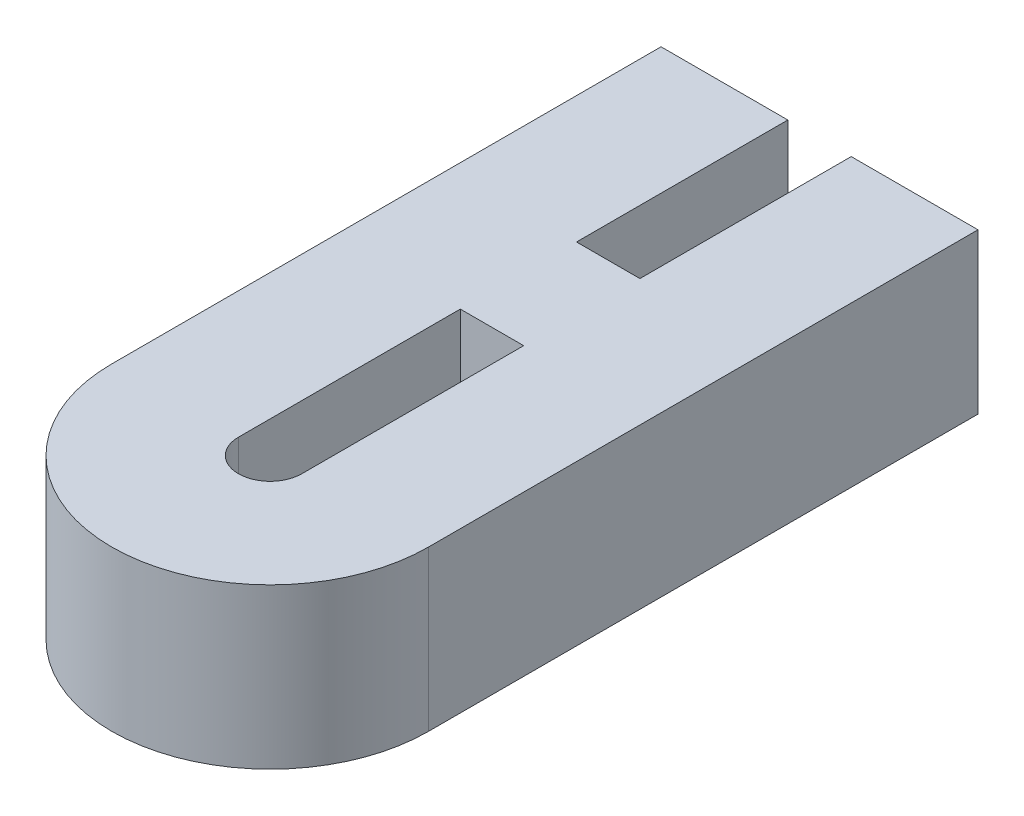
ISO-10303-21;
HEADER;
FILE_DESCRIPTION(('STEP AP214'),'2;1');
FILE_NAME('part.step','',(''),(''),'','','');
FILE_SCHEMA(('AUTOMOTIVE_DESIGN { 1 0 10303 214 1 1 1 1 }'));
ENDSEC;
DATA;
#1=APPLICATION_CONTEXT('core data for automotive mechanical design processes');
#2=APPLICATION_PROTOCOL_DEFINITION('international standard','automotive_design',2000,#1);
#3=PRODUCT_CONTEXT('',#1,'mechanical');
#4=PRODUCT('Part','Part','',(#3));
#5=PRODUCT_RELATED_PRODUCT_CATEGORY('part','',(#4));
#6=PRODUCT_DEFINITION_FORMATION('','',#4);
#7=PRODUCT_DEFINITION_CONTEXT('part definition',#1,'design');
#8=PRODUCT_DEFINITION('design','',#6,#7);
#9=PRODUCT_DEFINITION_SHAPE('','',#8);
#10=(LENGTH_UNIT() NAMED_UNIT(*) SI_UNIT(.MILLI.,.METRE.));
#11=(NAMED_UNIT(*) PLANE_ANGLE_UNIT() SI_UNIT($,.RADIAN.));
#12=(NAMED_UNIT(*) SI_UNIT($,.STERADIAN.) SOLID_ANGLE_UNIT());
#13=UNCERTAINTY_MEASURE_WITH_UNIT(LENGTH_MEASURE(1.E-05),#10,'distance_accuracy_value','');
#14=(GEOMETRIC_REPRESENTATION_CONTEXT(3) GLOBAL_UNCERTAINTY_ASSIGNED_CONTEXT((#13)) GLOBAL_UNIT_ASSIGNED_CONTEXT((#10,
#11,#12)) REPRESENTATION_CONTEXT('',''));
#15=CARTESIAN_POINT('',(0.,0.,0.));
#16=DIRECTION('',(0.,0.,1.));
#17=DIRECTION('',(1.,0.,0.));
#18=AXIS2_PLACEMENT_3D('',#15,#16,#17);
#19=CARTESIAN_POINT('',(1791.35975597724,-278.499891429945,2589.62563346975));
#20=DIRECTION('',(0.,-1.,0.));
#21=DIRECTION('',(0.,0.,-1.));
#22=AXIS2_PLACEMENT_3D('',#19,#20,#21);
#23=PLANE('',#22);
#24=DIRECTION('',(1.,0.,0.));
#25=VECTOR('',#24,1.);
#26=CARTESIAN_POINT('',(1796.07481015761,-278.499891429945,2507.8980276768));
#27=LINE('',#26,#25);
#28=CARTESIAN_POINT('',(1796.07481015761,-278.499891429945,2507.8980276768));
#29=VERTEX_POINT('',#28);
#30=CARTESIAN_POINT('',(1814.93502687905,-278.499891429945,2507.8980276768));
#31=VERTEX_POINT('',#30);
#32=EDGE_CURVE('E121',#29,#31,#27,.T.);
#33=ORIENTED_EDGE('',*,*,#32,.F.);
#34=DIRECTION('',(0.,0.,-1.));
#35=VECTOR('',#34,1.);
#36=CARTESIAN_POINT('',(1796.07481015761,-278.499891429945,2539.33172221255));
#37=LINE('',#36,#35);
#38=CARTESIAN_POINT('',(1796.07481015761,-278.499891429945,2539.33172221255));
#39=VERTEX_POINT('',#38);
#40=EDGE_CURVE('E150',#39,#29,#37,.T.);
#41=ORIENTED_EDGE('',*,*,#40,.F.);
#42=DIRECTION('',(1.,0.,0.));
#43=VECTOR('',#42,1.);
#44=CARTESIAN_POINT('',(1786.64470179688,-278.499891429945,2539.33172221255));
#45=LINE('',#44,#43);
#46=CARTESIAN_POINT('',(1786.64470179688,-278.499891429945,2539.33172221255));
#47=VERTEX_POINT('',#46);
#48=EDGE_CURVE('E147',#47,#39,#45,.T.);
#49=ORIENTED_EDGE('',*,*,#48,.F.);
#50=DIRECTION('',(0.,0.,1.));
#51=VECTOR('',#50,1.);
#52=CARTESIAN_POINT('',(1786.64470179688,-278.499891429945,2507.8980276768));
#53=LINE('',#52,#51);
#54=CARTESIAN_POINT('',(1786.64470179688,-278.499891429945,2507.8980276768));
#55=VERTEX_POINT('',#54);
#56=EDGE_CURVE('E144',#55,#47,#53,.T.);
#57=ORIENTED_EDGE('',*,*,#56,.F.);
#58=DIRECTION('',(1.,0.,0.));
#59=VECTOR('',#58,1.);
#60=CARTESIAN_POINT('',(1767.78448507543,-278.499891429945,2507.8980276768));
#61=LINE('',#60,#59);
#62=CARTESIAN_POINT('',(1767.78448507543,-278.499891429945,2507.8980276768));
#63=VERTEX_POINT('',#62);
#64=EDGE_CURVE('E141',#63,#55,#61,.T.);
#65=ORIENTED_EDGE('',*,*,#64,.F.);
#66=DIRECTION('',(0.,0.,-1.));
#67=VECTOR('',#66,1.);
#68=CARTESIAN_POINT('',(1767.78448507543,-278.499891429945,2589.62563346975));
#69=LINE('',#68,#67);
#70=CARTESIAN_POINT('',(1767.78448507543,-278.499891429945,2589.62563346975));
#71=VERTEX_POINT('',#70);
#72=EDGE_CURVE('E138',#71,#63,#69,.T.);
#73=ORIENTED_EDGE('',*,*,#72,.F.);
#74=CARTESIAN_POINT('',(1791.35975597724,-278.499891429945,2589.62563346975));
#75=DIRECTION('',(0.,-1.,0.));
#76=DIRECTION('',(0.,0.,-1.));
#77=AXIS2_PLACEMENT_3D('',#74,#75,#76);
#78=CIRCLE('',#77,23.5752709018111);
#79=CARTESIAN_POINT('',(1814.93502687905,-278.499891429945,2589.62563346975));
#80=VERTEX_POINT('',#79);
#81=EDGE_CURVE('E135',#80,#71,#78,.T.);
#82=ORIENTED_EDGE('',*,*,#81,.F.);
#83=DIRECTION('',(0.,0.,1.));
#84=VECTOR('',#83,1.);
#85=CARTESIAN_POINT('',(1814.93502687905,-278.499891429945,2507.8980276768));
#86=LINE('',#85,#84);
#87=EDGE_CURVE('E132',#31,#80,#86,.T.);
#88=ORIENTED_EDGE('',*,*,#87,.F.);
#89=EDGE_LOOP('',(#33,#41,#49,#57,#65,#73,#82,#88));
#90=FACE_BOUND('',#89,.T.);
#91=DIRECTION('',(0.,0.,1.));
#92=VECTOR('',#91,1.);
#93=CARTESIAN_POINT('',(1786.64470179688,-278.499891429945,2556.62025420721));
#94=LINE('',#93,#92);
#95=CARTESIAN_POINT('',(1786.64470179688,-278.499891429945,2556.62025420721));
#96=VERTEX_POINT('',#95);
#97=CARTESIAN_POINT('',(1786.64470179688,-278.499891429945,2589.62563346975));
#98=VERTEX_POINT('',#97);
#99=EDGE_CURVE('E109',#96,#98,#94,.T.);
#100=ORIENTED_EDGE('',*,*,#99,.F.);
#101=DIRECTION('',(-1.,0.,0.));
#102=VECTOR('',#101,1.);
#103=CARTESIAN_POINT('',(1796.07481015761,-278.499891429945,2556.62025420721));
#104=LINE('',#103,#102);
#105=CARTESIAN_POINT('',(1796.07481015761,-278.499891429945,2556.62025420721));
#106=VERTEX_POINT('',#105);
#107=EDGE_CURVE('E117',#106,#96,#104,.T.);
#108=ORIENTED_EDGE('',*,*,#107,.F.);
#109=DIRECTION('',(0.,0.,-1.));
#110=VECTOR('',#109,1.);
#111=CARTESIAN_POINT('',(1796.07481015761,-278.499891429945,2589.62563346975));
#112=LINE('',#111,#110);
#113=CARTESIAN_POINT('',(1796.07481015761,-278.499891429953,2589.62563346975));
#114=VERTEX_POINT('',#113);
#115=EDGE_CURVE('E122',#114,#106,#112,.T.);
#116=ORIENTED_EDGE('',*,*,#115,.F.);
#117=CARTESIAN_POINT('',(1791.35975597724,-278.499891429953,2589.62563346975));
#118=DIRECTION('',(0.,1.,0.));
#119=DIRECTION('',(0.,0.,-1.));
#120=AXIS2_PLACEMENT_3D('',#117,#118,#119);
#121=CIRCLE('',#120,4.71505418036223);
#122=EDGE_CURVE('E125',#98,#114,#121,.T.);
#123=ORIENTED_EDGE('',*,*,#122,.F.);
#124=EDGE_LOOP('',(#100,#108,#116,#123));
#125=FACE_BOUND('',#124,.T.);
#126=ADVANCED_FACE('F16',(#90,#125),#23,.F.);
#127=CARTESIAN_POINT('',(1796.07481015761,-282.250162855083,2589.62563346975));
#128=DIRECTION('',(-1.,0.,0.));
#129=DIRECTION('',(0.,0.,1.));
#130=AXIS2_PLACEMENT_3D('',#127,#128,#129);
#131=PLANE('',#130);
#132=DIRECTION('',(0.,-1.,0.));
#133=VECTOR('',#132,1.);
#134=CARTESIAN_POINT('',(1796.07481015761,-282.250162855083,2589.62563346975));
#135=LINE('',#134,#133);
#136=CARTESIAN_POINT('',(1796.07481015761,-302.250162855083,2589.62563346975));
#137=VERTEX_POINT('',#136);
#138=EDGE_CURVE('E159',#114,#137,#135,.T.);
#139=ORIENTED_EDGE('',*,*,#138,.F.);
#140=ORIENTED_EDGE('',*,*,#115,.T.);
#141=DIRECTION('',(0.,-1.,0.));
#142=VECTOR('',#141,1.);
#143=CARTESIAN_POINT('',(1796.07481015761,-282.250162855083,2556.62025420721));
#144=LINE('',#143,#142);
#145=CARTESIAN_POINT('',(1796.07481015761,-302.250162855083,2556.62025420721));
#146=VERTEX_POINT('',#145);
#147=EDGE_CURVE('E20',#106,#146,#144,.T.);
#148=ORIENTED_EDGE('',*,*,#147,.T.);
#149=DIRECTION('',(0.,0.,-1.));
#150=VECTOR('',#149,1.);
#151=CARTESIAN_POINT('',(1796.07481015761,-302.250162855083,2589.62563346975));
#152=LINE('',#151,#150);
#153=EDGE_CURVE('E153',#137,#146,#152,.T.);
#154=ORIENTED_EDGE('',*,*,#153,.F.);
#155=EDGE_LOOP('',(#139,#140,#148,#154));
#156=FACE_BOUND('',#155,.T.);
#157=ADVANCED_FACE('F201',(#156),#131,.T.);
#158=CARTESIAN_POINT('',(1791.35975597724,-282.250162855083,2589.62563346975));
#159=DIRECTION('',(0.,-1.,0.));
#160=DIRECTION('',(0.,0.,-1.));
#161=AXIS2_PLACEMENT_3D('',#158,#159,#160);
#162=CYLINDRICAL_SURFACE('',#161,4.71505418036223);
#163=DIRECTION('',(0.,-1.,0.));
#164=VECTOR('',#163,1.);
#165=CARTESIAN_POINT('',(1786.64470179688,-282.250162855083,2589.62563346975));
#166=LINE('',#165,#164);
#167=CARTESIAN_POINT('',(1786.64470179688,-302.250162855083,2589.62563346975));
#168=VERTEX_POINT('',#167);
#169=EDGE_CURVE('E155',#98,#168,#166,.T.);
#170=ORIENTED_EDGE('',*,*,#169,.F.);
#171=ORIENTED_EDGE('',*,*,#122,.T.);
#172=ORIENTED_EDGE('',*,*,#138,.T.);
#173=CARTESIAN_POINT('',(1791.35975597724,-302.250162855083,2589.62563346975));
#174=DIRECTION('',(0.,-1.,0.));
#175=DIRECTION('',(-1.,0.,0.));
#176=AXIS2_PLACEMENT_3D('',#173,#174,#175);
#177=CIRCLE('',#176,4.71505418036223);
#178=EDGE_CURVE('E156',#137,#168,#177,.T.);
#179=ORIENTED_EDGE('',*,*,#178,.T.);
#180=EDGE_LOOP('',(#170,#171,#172,#179));
#181=FACE_BOUND('',#180,.T.);
#182=ADVANCED_FACE('F205',(#181),#162,.F.);
#183=CARTESIAN_POINT('',(1786.64470179688,-282.250162855083,2589.62563346975));
#184=DIRECTION('',(-1.,0.,0.));
#185=DIRECTION('',(0.,0.,1.));
#186=AXIS2_PLACEMENT_3D('',#183,#184,#185);
#187=PLANE('',#186);
#188=DIRECTION('',(0.,-1.,0.));
#189=VECTOR('',#188,1.);
#190=CARTESIAN_POINT('',(1786.64470179688,-282.250162855083,2556.62025420721));
#191=LINE('',#190,#189);
#192=CARTESIAN_POINT('',(1786.64470179688,-302.250162855083,2556.62025420721));
#193=VERTEX_POINT('',#192);
#194=EDGE_CURVE('E106',#96,#193,#191,.T.);
#195=ORIENTED_EDGE('',*,*,#194,.F.);
#196=ORIENTED_EDGE('',*,*,#99,.T.);
#197=ORIENTED_EDGE('',*,*,#169,.T.);
#198=DIRECTION('',(0.,0.,-1.));
#199=VECTOR('',#198,1.);
#200=CARTESIAN_POINT('',(1786.64470179688,-302.250162855083,2589.62563346975));
#201=LINE('',#200,#199);
#202=EDGE_CURVE('E112',#168,#193,#201,.T.);
#203=ORIENTED_EDGE('',*,*,#202,.T.);
#204=EDGE_LOOP('',(#195,#196,#197,#203));
#205=FACE_BOUND('',#204,.T.);
#206=ADVANCED_FACE('F107',(#205),#187,.F.);
#207=CARTESIAN_POINT('',(1786.64470179688,-282.250162855083,2556.62025420721));
#208=DIRECTION('',(0.,0.,-1.));
#209=DIRECTION('',(-1.,0.,0.));
#210=AXIS2_PLACEMENT_3D('',#207,#208,#209);
#211=PLANE('',#210);
#212=ORIENTED_EDGE('',*,*,#147,.F.);
#213=ORIENTED_EDGE('',*,*,#107,.T.);
#214=ORIENTED_EDGE('',*,*,#194,.T.);
#215=DIRECTION('',(1.,0.,0.));
#216=VECTOR('',#215,1.);
#217=CARTESIAN_POINT('',(1786.64470179688,-302.250162855083,2556.62025420721));
#218=LINE('',#217,#216);
#219=EDGE_CURVE('E114',#193,#146,#218,.T.);
#220=ORIENTED_EDGE('',*,*,#219,.T.);
#221=EDGE_LOOP('',(#212,#213,#214,#220));
#222=FACE_BOUND('',#221,.T.);
#223=ADVANCED_FACE('F118',(#222),#211,.F.);
#224=CARTESIAN_POINT('',(1791.35975597724,-302.250162855083,2589.62563346975));
#225=DIRECTION('',(0.,-1.,0.));
#226=DIRECTION('',(0.,0.,-1.));
#227=AXIS2_PLACEMENT_3D('',#224,#225,#226);
#228=PLANE('',#227);
#229=ORIENTED_EDGE('',*,*,#219,.F.);
#230=ORIENTED_EDGE('',*,*,#202,.F.);
#231=ORIENTED_EDGE('',*,*,#178,.F.);
#232=ORIENTED_EDGE('',*,*,#153,.T.);
#233=EDGE_LOOP('',(#229,#230,#231,#232));
#234=FACE_BOUND('',#233,.T.);
#235=DIRECTION('',(0.,0.,-1.));
#236=VECTOR('',#235,1.);
#237=CARTESIAN_POINT('',(1796.07481015761,-302.250162855083,2539.33172221255));
#238=LINE('',#237,#236);
#239=CARTESIAN_POINT('',(1796.07481015761,-302.250162855083,2539.33172221255));
#240=VERTEX_POINT('',#239);
#241=CARTESIAN_POINT('',(1796.07481015761,-302.250162855083,2507.8980276768));
#242=VERTEX_POINT('',#241);
#243=EDGE_CURVE('E162',#240,#242,#238,.T.);
#244=ORIENTED_EDGE('',*,*,#243,.T.);
#245=DIRECTION('',(-1.,0.,0.));
#246=VECTOR('',#245,1.);
#247=CARTESIAN_POINT('',(1814.93502687905,-302.250162855083,2507.8980276768));
#248=LINE('',#247,#246);
#249=CARTESIAN_POINT('',(1814.93502687905,-302.250162855083,2507.8980276768));
#250=VERTEX_POINT('',#249);
#251=EDGE_CURVE('E25',#250,#242,#248,.T.);
#252=ORIENTED_EDGE('',*,*,#251,.F.);
#253=DIRECTION('',(0.,0.,-1.));
#254=VECTOR('',#253,1.);
#255=CARTESIAN_POINT('',(1814.93502687905,-302.250162855083,2589.62563346975));
#256=LINE('',#255,#254);
#257=CARTESIAN_POINT('',(1814.93502687905,-302.250162855083,2589.62563346975));
#258=VERTEX_POINT('',#257);
#259=EDGE_CURVE('E184',#258,#250,#256,.T.);
#260=ORIENTED_EDGE('',*,*,#259,.F.);
#261=CARTESIAN_POINT('',(1791.35975597724,-302.250162855083,2589.62563346975));
#262=DIRECTION('',(0.,-1.,0.));
#263=DIRECTION('',(-1.,0.,0.));
#264=AXIS2_PLACEMENT_3D('',#261,#262,#263);
#265=CIRCLE('',#264,23.5752709018111);
#266=CARTESIAN_POINT('',(1767.78448507543,-302.250162855083,2589.62563346975));
#267=VERTEX_POINT('',#266);
#268=EDGE_CURVE('E165',#258,#267,#265,.T.);
#269=ORIENTED_EDGE('',*,*,#268,.T.);
#270=DIRECTION('',(0.,0.,-1.));
#271=VECTOR('',#270,1.);
#272=CARTESIAN_POINT('',(1767.78448507543,-302.250162855083,2589.62563346975));
#273=LINE('',#272,#271);
#274=CARTESIAN_POINT('',(1767.78448507543,-302.250162855083,2507.8980276768));
#275=VERTEX_POINT('',#274);
#276=EDGE_CURVE('E170',#267,#275,#273,.T.);
#277=ORIENTED_EDGE('',*,*,#276,.T.);
#278=DIRECTION('',(-1.,0.,0.));
#279=VECTOR('',#278,1.);
#280=CARTESIAN_POINT('',(1786.64470179688,-302.250162855083,2507.8980276768));
#281=LINE('',#280,#279);
#282=CARTESIAN_POINT('',(1786.64470179688,-302.250162855083,2507.8980276768));
#283=VERTEX_POINT('',#282);
#284=EDGE_CURVE('E176',#283,#275,#281,.T.);
#285=ORIENTED_EDGE('',*,*,#284,.F.);
#286=DIRECTION('',(0.,0.,-1.));
#287=VECTOR('',#286,1.);
#288=CARTESIAN_POINT('',(1786.64470179688,-302.250162855083,2539.33172221255));
#289=LINE('',#288,#287);
#290=CARTESIAN_POINT('',(1786.64470179688,-302.250162855083,2539.33172221255));
#291=VERTEX_POINT('',#290);
#292=EDGE_CURVE('E171',#291,#283,#289,.T.);
#293=ORIENTED_EDGE('',*,*,#292,.F.);
#294=DIRECTION('',(1.,0.,0.));
#295=VECTOR('',#294,1.);
#296=CARTESIAN_POINT('',(1786.64470179688,-302.250162855083,2539.33172221255));
#297=LINE('',#296,#295);
#298=EDGE_CURVE('E166',#291,#240,#297,.T.);
#299=ORIENTED_EDGE('',*,*,#298,.T.);
#300=EDGE_LOOP('',(#244,#252,#260,#269,#277,#285,#293,#299));
#301=FACE_BOUND('',#300,.T.);
#302=ADVANCED_FACE('F18',(#234,#301),#228,.T.);
#303=CARTESIAN_POINT('',(1786.64470179688,-282.250162855083,2539.33172221255));
#304=DIRECTION('',(0.,0.,-1.));
#305=DIRECTION('',(-1.,0.,0.));
#306=AXIS2_PLACEMENT_3D('',#303,#304,#305);
#307=PLANE('',#306);
#308=DIRECTION('',(0.,-1.,0.));
#309=VECTOR('',#308,1.);
#310=CARTESIAN_POINT('',(1786.64470179688,-282.250162855083,2539.33172221255));
#311=LINE('',#310,#309);
#312=EDGE_CURVE('E175',#47,#291,#311,.T.);
#313=ORIENTED_EDGE('',*,*,#312,.F.);
#314=ORIENTED_EDGE('',*,*,#48,.T.);
#315=DIRECTION('',(0.,-1.,0.));
#316=VECTOR('',#315,1.);
#317=CARTESIAN_POINT('',(1796.07481015761,-282.250162855083,2539.33172221255));
#318=LINE('',#317,#316);
#319=EDGE_CURVE('E169',#39,#240,#318,.T.);
#320=ORIENTED_EDGE('',*,*,#319,.T.);
#321=ORIENTED_EDGE('',*,*,#298,.F.);
#322=EDGE_LOOP('',(#313,#314,#320,#321));
#323=FACE_BOUND('',#322,.T.);
#324=ADVANCED_FACE('F248',(#323),#307,.T.);
#325=CARTESIAN_POINT('',(1786.64470179688,-282.250162855083,2539.33172221255));
#326=DIRECTION('',(-1.,0.,0.));
#327=DIRECTION('',(0.,0.,1.));
#328=AXIS2_PLACEMENT_3D('',#325,#326,#327);
#329=PLANE('',#328);
#330=DIRECTION('',(0.,-1.,0.));
#331=VECTOR('',#330,1.);
#332=CARTESIAN_POINT('',(1786.64470179688,-282.250162855083,2507.8980276768));
#333=LINE('',#332,#331);
#334=EDGE_CURVE('E174',#55,#283,#333,.T.);
#335=ORIENTED_EDGE('',*,*,#334,.F.);
#336=ORIENTED_EDGE('',*,*,#56,.T.);
#337=ORIENTED_EDGE('',*,*,#312,.T.);
#338=ORIENTED_EDGE('',*,*,#292,.T.);
#339=EDGE_LOOP('',(#335,#336,#337,#338));
#340=FACE_BOUND('',#339,.T.);
#341=ADVANCED_FACE('F244',(#340),#329,.F.);
#342=CARTESIAN_POINT('',(1786.64470179688,-282.250162855083,2507.8980276768));
#343=DIRECTION('',(0.,0.,1.));
#344=DIRECTION('',(1.,0.,0.));
#345=AXIS2_PLACEMENT_3D('',#342,#343,#344);
#346=PLANE('',#345);
#347=DIRECTION('',(0.,-1.,0.));
#348=VECTOR('',#347,1.);
#349=CARTESIAN_POINT('',(1767.78448507543,-282.250162855083,2507.8980276768));
#350=LINE('',#349,#348);
#351=EDGE_CURVE('E179',#63,#275,#350,.T.);
#352=ORIENTED_EDGE('',*,*,#351,.F.);
#353=ORIENTED_EDGE('',*,*,#64,.T.);
#354=ORIENTED_EDGE('',*,*,#334,.T.);
#355=ORIENTED_EDGE('',*,*,#284,.T.);
#356=EDGE_LOOP('',(#352,#353,#354,#355));
#357=FACE_BOUND('',#356,.T.);
#358=ADVANCED_FACE('F240',(#357),#346,.F.);
#359=CARTESIAN_POINT('',(1767.78448507543,-282.250162855083,2589.62563346975));
#360=DIRECTION('',(-1.,0.,0.));
#361=DIRECTION('',(0.,0.,1.));
#362=AXIS2_PLACEMENT_3D('',#359,#360,#361);
#363=PLANE('',#362);
#364=DIRECTION('',(0.,-1.,0.));
#365=VECTOR('',#364,1.);
#366=CARTESIAN_POINT('',(1767.78448507543,-282.250162855083,2589.62563346975));
#367=LINE('',#366,#365);
#368=EDGE_CURVE('E192',#71,#267,#367,.T.);
#369=ORIENTED_EDGE('',*,*,#368,.F.);
#370=ORIENTED_EDGE('',*,*,#72,.T.);
#371=ORIENTED_EDGE('',*,*,#351,.T.);
#372=ORIENTED_EDGE('',*,*,#276,.F.);
#373=EDGE_LOOP('',(#369,#370,#371,#372));
#374=FACE_BOUND('',#373,.T.);
#375=ADVANCED_FACE('F236',(#374),#363,.T.);
#376=CARTESIAN_POINT('',(1791.35975597724,-282.250162855083,2589.62563346975));
#377=DIRECTION('',(0.,-1.,0.));
#378=DIRECTION('',(0.,0.,-1.));
#379=AXIS2_PLACEMENT_3D('',#376,#377,#378);
#380=CYLINDRICAL_SURFACE('',#379,23.5752709018111);
#381=DIRECTION('',(0.,-1.,0.));
#382=VECTOR('',#381,1.);
#383=CARTESIAN_POINT('',(1814.93502687905,-282.250162855083,2589.62563346975));
#384=LINE('',#383,#382);
#385=EDGE_CURVE('E188',#80,#258,#384,.T.);
#386=ORIENTED_EDGE('',*,*,#385,.F.);
#387=ORIENTED_EDGE('',*,*,#81,.T.);
#388=ORIENTED_EDGE('',*,*,#368,.T.);
#389=ORIENTED_EDGE('',*,*,#268,.F.);
#390=EDGE_LOOP('',(#386,#387,#388,#389));
#391=FACE_BOUND('',#390,.T.);
#392=ADVANCED_FACE('F232',(#391),#380,.T.);
#393=CARTESIAN_POINT('',(1814.93502687905,-282.250162855083,2589.62563346975));
#394=DIRECTION('',(-1.,0.,0.));
#395=DIRECTION('',(0.,0.,1.));
#396=AXIS2_PLACEMENT_3D('',#393,#394,#395);
#397=PLANE('',#396);
#398=DIRECTION('',(0.,-1.,0.));
#399=VECTOR('',#398,1.);
#400=CARTESIAN_POINT('',(1814.93502687905,-282.250162855083,2507.8980276768));
#401=LINE('',#400,#399);
#402=EDGE_CURVE('E187',#31,#250,#401,.T.);
#403=ORIENTED_EDGE('',*,*,#402,.F.);
#404=ORIENTED_EDGE('',*,*,#87,.T.);
#405=ORIENTED_EDGE('',*,*,#385,.T.);
#406=ORIENTED_EDGE('',*,*,#259,.T.);
#407=EDGE_LOOP('',(#403,#404,#405,#406));
#408=FACE_BOUND('',#407,.T.);
#409=ADVANCED_FACE('F228',(#408),#397,.F.);
#410=CARTESIAN_POINT('',(1814.93502687905,-282.250162855083,2507.8980276768));
#411=DIRECTION('',(0.,0.,1.));
#412=DIRECTION('',(1.,0.,0.));
#413=AXIS2_PLACEMENT_3D('',#410,#411,#412);
#414=PLANE('',#413);
#415=DIRECTION('',(0.,-1.,0.));
#416=VECTOR('',#415,1.);
#417=CARTESIAN_POINT('',(1796.07481015761,-282.250162855083,2507.8980276768));
#418=LINE('',#417,#416);
#419=EDGE_CURVE('E11',#29,#242,#418,.T.);
#420=ORIENTED_EDGE('',*,*,#419,.F.);
#421=ORIENTED_EDGE('',*,*,#32,.T.);
#422=ORIENTED_EDGE('',*,*,#402,.T.);
#423=ORIENTED_EDGE('',*,*,#251,.T.);
#424=EDGE_LOOP('',(#420,#421,#422,#423));
#425=FACE_BOUND('',#424,.T.);
#426=ADVANCED_FACE('F225',(#425),#414,.F.);
#427=CARTESIAN_POINT('',(1796.07481015761,-282.250162855083,2539.33172221255));
#428=DIRECTION('',(-1.,0.,0.));
#429=DIRECTION('',(0.,0.,1.));
#430=AXIS2_PLACEMENT_3D('',#427,#428,#429);
#431=PLANE('',#430);
#432=ORIENTED_EDGE('',*,*,#319,.F.);
#433=ORIENTED_EDGE('',*,*,#40,.T.);
#434=ORIENTED_EDGE('',*,*,#419,.T.);
#435=ORIENTED_EDGE('',*,*,#243,.F.);
#436=EDGE_LOOP('',(#432,#433,#434,#435));
#437=FACE_BOUND('',#436,.T.);
#438=ADVANCED_FACE('F222',(#437),#431,.T.);
#439=CLOSED_SHELL('',(#126,#157,#182,#206,#223,#302,#324,#341,#358,#375,#392,#409,#426,#438));
#440=MANIFOLD_SOLID_BREP('B1',#439);
#441=ADVANCED_BREP_SHAPE_REPRESENTATION('',(#18,#440),#14);
#442=SHAPE_DEFINITION_REPRESENTATION(#9,#441);
ENDSEC;
END-ISO-10303-21;
